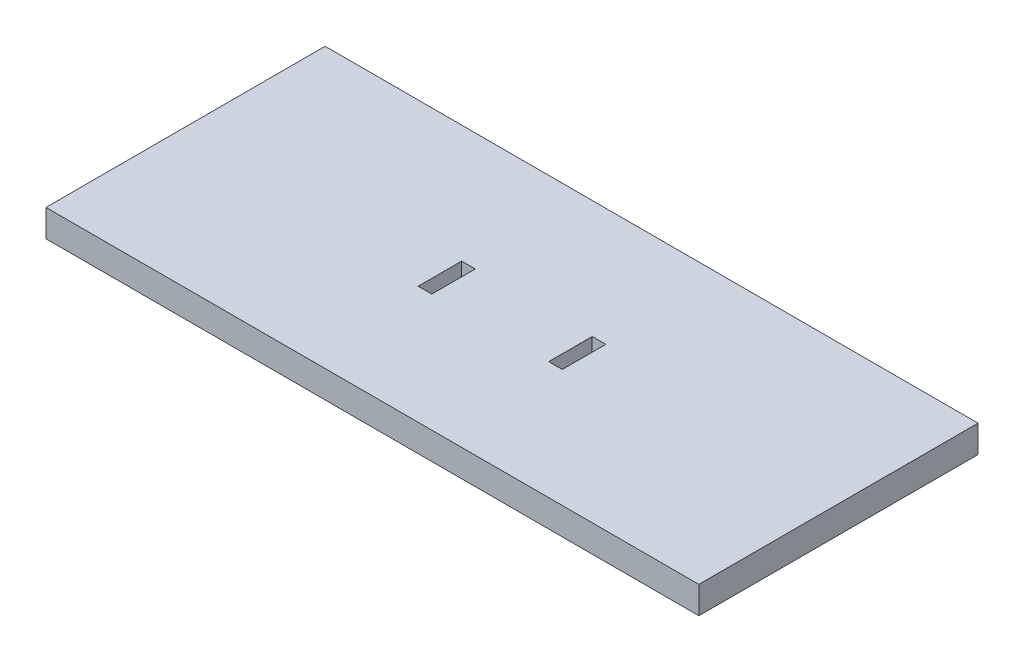
ISO-10303-21;
HEADER;
FILE_DESCRIPTION(('STEP AP214'),'2;1');
FILE_NAME('part.step','',(''),(''),'','','');
FILE_SCHEMA(('AUTOMOTIVE_DESIGN { 1 0 10303 214 1 1 1 1 }'));
ENDSEC;
DATA;
#1=APPLICATION_CONTEXT('core data for automotive mechanical design processes');
#2=APPLICATION_PROTOCOL_DEFINITION('international standard','automotive_design',2000,#1);
#3=PRODUCT_CONTEXT('',#1,'mechanical');
#4=PRODUCT('Part','Part','',(#3));
#5=PRODUCT_RELATED_PRODUCT_CATEGORY('part','',(#4));
#6=PRODUCT_DEFINITION_FORMATION('','',#4);
#7=PRODUCT_DEFINITION_CONTEXT('part definition',#1,'design');
#8=PRODUCT_DEFINITION('design','',#6,#7);
#9=PRODUCT_DEFINITION_SHAPE('','',#8);
#10=(LENGTH_UNIT() NAMED_UNIT(*) SI_UNIT(.MILLI.,.METRE.));
#11=(NAMED_UNIT(*) PLANE_ANGLE_UNIT() SI_UNIT($,.RADIAN.));
#12=(NAMED_UNIT(*) SI_UNIT($,.STERADIAN.) SOLID_ANGLE_UNIT());
#13=UNCERTAINTY_MEASURE_WITH_UNIT(LENGTH_MEASURE(1.E-05),#10,'distance_accuracy_value','');
#14=(GEOMETRIC_REPRESENTATION_CONTEXT(3) GLOBAL_UNCERTAINTY_ASSIGNED_CONTEXT((#13)) GLOBAL_UNIT_ASSIGNED_CONTEXT((#10,
#11,#12)) REPRESENTATION_CONTEXT('',''));
#15=CARTESIAN_POINT('',(0.,0.,0.));
#16=DIRECTION('',(0.,0.,1.));
#17=DIRECTION('',(1.,0.,0.));
#18=AXIS2_PLACEMENT_3D('',#15,#16,#17);
#19=CARTESIAN_POINT('',(0.,5.,0.));
#20=DIRECTION('',(0.,1.,0.));
#21=DIRECTION('',(0.,0.,1.));
#22=AXIS2_PLACEMENT_3D('',#19,#20,#21);
#23=PLANE('',#22);
#24=DIRECTION('',(0.,0.,-1.));
#25=VECTOR('',#24,1.);
#26=CARTESIAN_POINT('',(60.,5.,-25.6535));
#27=LINE('',#26,#25);
#28=CARTESIAN_POINT('',(60.,5.,25.6535));
#29=VERTEX_POINT('',#28);
#30=CARTESIAN_POINT('',(60.,5.,-25.6535));
#31=VERTEX_POINT('',#30);
#32=EDGE_CURVE('E220',#29,#31,#27,.T.);
#33=ORIENTED_EDGE('',*,*,#32,.T.);
#34=DIRECTION('',(-1.,0.,0.));
#35=VECTOR('',#34,1.);
#36=CARTESIAN_POINT('',(-60.,5.,-25.6535));
#37=LINE('',#36,#35);
#38=CARTESIAN_POINT('',(-60.,5.,-25.6535));
#39=VERTEX_POINT('',#38);
#40=EDGE_CURVE('E224',#31,#39,#37,.T.);
#41=ORIENTED_EDGE('',*,*,#40,.T.);
#42=DIRECTION('',(0.,0.,1.));
#43=VECTOR('',#42,1.);
#44=CARTESIAN_POINT('',(-60.,5.,-25.6535));
#45=LINE('',#44,#43);
#46=CARTESIAN_POINT('',(-60.,5.,25.6535));
#47=VERTEX_POINT('',#46);
#48=EDGE_CURVE('E228',#39,#47,#45,.T.);
#49=ORIENTED_EDGE('',*,*,#48,.T.);
#50=DIRECTION('',(1.,0.,0.));
#51=VECTOR('',#50,1.);
#52=CARTESIAN_POINT('',(-60.,5.,25.6535));
#53=LINE('',#52,#51);
#54=EDGE_CURVE('E231',#47,#29,#53,.T.);
#55=ORIENTED_EDGE('',*,*,#54,.T.);
#56=EDGE_LOOP('',(#33,#41,#49,#55));
#57=FACE_BOUND('',#56,.T.);
#58=DIRECTION('',(-1.,0.,0.));
#59=VECTOR('',#58,1.);
#60=CARTESIAN_POINT('',(-13.25,5.,-3.99999999999999));
#61=LINE('',#60,#59);
#62=CARTESIAN_POINT('',(-10.75,5.,-3.99999999999999));
#63=VERTEX_POINT('',#62);
#64=CARTESIAN_POINT('',(-13.25,5.,-3.99999999999999));
#65=VERTEX_POINT('',#64);
#66=EDGE_CURVE('E180',#63,#65,#61,.T.);
#67=ORIENTED_EDGE('',*,*,#66,.F.);
#68=DIRECTION('',(0.,0.,-1.));
#69=VECTOR('',#68,1.);
#70=CARTESIAN_POINT('',(-10.75,5.,-3.99999999999999));
#71=LINE('',#70,#69);
#72=CARTESIAN_POINT('',(-10.75,5.,4.00000000000001));
#73=VERTEX_POINT('',#72);
#74=EDGE_CURVE('E177',#73,#63,#71,.T.);
#75=ORIENTED_EDGE('',*,*,#74,.F.);
#76=DIRECTION('',(1.,0.,0.));
#77=VECTOR('',#76,1.);
#78=CARTESIAN_POINT('',(-13.25,5.,4.00000000000001));
#79=LINE('',#78,#77);
#80=CARTESIAN_POINT('',(-13.25,5.,4.00000000000001));
#81=VERTEX_POINT('',#80);
#82=EDGE_CURVE('E188',#81,#73,#79,.T.);
#83=ORIENTED_EDGE('',*,*,#82,.F.);
#84=DIRECTION('',(0.,0.,1.));
#85=VECTOR('',#84,1.);
#86=CARTESIAN_POINT('',(-13.25,5.,-3.99999999999999));
#87=LINE('',#86,#85);
#88=EDGE_CURVE('E184',#65,#81,#87,.T.);
#89=ORIENTED_EDGE('',*,*,#88,.F.);
#90=EDGE_LOOP('',(#67,#75,#83,#89));
#91=FACE_BOUND('',#90,.T.);
#92=DIRECTION('',(-1.,0.,0.));
#93=VECTOR('',#92,1.);
#94=CARTESIAN_POINT('',(13.25,5.,-3.99999999999999));
#95=LINE('',#94,#93);
#96=CARTESIAN_POINT('',(13.25,5.,-3.99999999999999));
#97=VERTEX_POINT('',#96);
#98=CARTESIAN_POINT('',(10.75,5.,-3.99999999999999));
#99=VERTEX_POINT('',#98);
#100=EDGE_CURVE('E138',#97,#99,#95,.T.);
#101=ORIENTED_EDGE('',*,*,#100,.F.);
#102=DIRECTION('',(0.,0.,-1.));
#103=VECTOR('',#102,1.);
#104=CARTESIAN_POINT('',(13.25,5.,-3.99999999999999));
#105=LINE('',#104,#103);
#106=CARTESIAN_POINT('',(13.25,5.,4.00000000000001));
#107=VERTEX_POINT('',#106);
#108=EDGE_CURVE('E129',#107,#97,#105,.T.);
#109=ORIENTED_EDGE('',*,*,#108,.F.);
#110=DIRECTION('',(1.,0.,0.));
#111=VECTOR('',#110,1.);
#112=CARTESIAN_POINT('',(13.25,5.,4.00000000000001));
#113=LINE('',#112,#111);
#114=CARTESIAN_POINT('',(10.75,5.,4.00000000000001));
#115=VERTEX_POINT('',#114);
#116=EDGE_CURVE('E155',#115,#107,#113,.T.);
#117=ORIENTED_EDGE('',*,*,#116,.F.);
#118=DIRECTION('',(0.,0.,1.));
#119=VECTOR('',#118,1.);
#120=CARTESIAN_POINT('',(10.75,5.,-3.99999999999999));
#121=LINE('',#120,#119);
#122=EDGE_CURVE('E151',#99,#115,#121,.T.);
#123=ORIENTED_EDGE('',*,*,#122,.F.);
#124=EDGE_LOOP('',(#101,#109,#117,#123));
#125=FACE_BOUND('',#124,.T.);
#126=ADVANCED_FACE('F39',(#57,#91,#125),#23,.T.);
#127=CARTESIAN_POINT('',(0.,0.,0.));
#128=DIRECTION('',(0.,1.,0.));
#129=DIRECTION('',(0.,0.,1.));
#130=AXIS2_PLACEMENT_3D('',#127,#128,#129);
#131=PLANE('',#130);
#132=DIRECTION('',(0.,0.,-1.));
#133=VECTOR('',#132,1.);
#134=CARTESIAN_POINT('',(-10.75,0.,-3.99999999999999));
#135=LINE('',#134,#133);
#136=CARTESIAN_POINT('',(-10.75,0.,4.00000000000001));
#137=VERTEX_POINT('',#136);
#138=CARTESIAN_POINT('',(-10.75,0.,-3.99999999999999));
#139=VERTEX_POINT('',#138);
#140=EDGE_CURVE('E147',#137,#139,#135,.T.);
#141=ORIENTED_EDGE('',*,*,#140,.T.);
#142=DIRECTION('',(-1.,0.,0.));
#143=VECTOR('',#142,1.);
#144=CARTESIAN_POINT('',(-13.25,0.,-3.99999999999999));
#145=LINE('',#144,#143);
#146=CARTESIAN_POINT('',(-13.25,0.,-3.99999999999999));
#147=VERTEX_POINT('',#146);
#148=EDGE_CURVE('E195',#139,#147,#145,.T.);
#149=ORIENTED_EDGE('',*,*,#148,.T.);
#150=DIRECTION('',(0.,0.,1.));
#151=VECTOR('',#150,1.);
#152=CARTESIAN_POINT('',(-13.25,0.,-3.99999999999999));
#153=LINE('',#152,#151);
#154=CARTESIAN_POINT('',(-13.25,0.,4.00000000000001));
#155=VERTEX_POINT('',#154);
#156=EDGE_CURVE('E199',#147,#155,#153,.T.);
#157=ORIENTED_EDGE('',*,*,#156,.T.);
#158=DIRECTION('',(1.,0.,0.));
#159=VECTOR('',#158,1.);
#160=CARTESIAN_POINT('',(-13.25,0.,4.00000000000001));
#161=LINE('',#160,#159);
#162=EDGE_CURVE('E181',#155,#137,#161,.T.);
#163=ORIENTED_EDGE('',*,*,#162,.T.);
#164=EDGE_LOOP('',(#141,#149,#157,#163));
#165=FACE_BOUND('',#164,.T.);
#166=DIRECTION('',(0.,0.,-1.));
#167=VECTOR('',#166,1.);
#168=CARTESIAN_POINT('',(60.,0.,-25.6535));
#169=LINE('',#168,#167);
#170=CARTESIAN_POINT('',(60.,0.,25.6535));
#171=VERTEX_POINT('',#170);
#172=CARTESIAN_POINT('',(60.,0.,-25.6535));
#173=VERTEX_POINT('',#172);
#174=EDGE_CURVE('E219',#171,#173,#169,.T.);
#175=ORIENTED_EDGE('',*,*,#174,.F.);
#176=DIRECTION('',(1.,0.,0.));
#177=VECTOR('',#176,1.);
#178=CARTESIAN_POINT('',(-60.,0.,25.6535));
#179=LINE('',#178,#177);
#180=CARTESIAN_POINT('',(-60.,0.,25.6535));
#181=VERTEX_POINT('',#180);
#182=EDGE_CURVE('E225',#181,#171,#179,.T.);
#183=ORIENTED_EDGE('',*,*,#182,.F.);
#184=DIRECTION('',(0.,0.,1.));
#185=VECTOR('',#184,1.);
#186=CARTESIAN_POINT('',(-60.,0.,-25.6535));
#187=LINE('',#186,#185);
#188=CARTESIAN_POINT('',(-60.,0.,-25.6535));
#189=VERTEX_POINT('',#188);
#190=EDGE_CURVE('E241',#189,#181,#187,.T.);
#191=ORIENTED_EDGE('',*,*,#190,.F.);
#192=DIRECTION('',(-1.,0.,0.));
#193=VECTOR('',#192,1.);
#194=CARTESIAN_POINT('',(-60.,0.,-25.6535));
#195=LINE('',#194,#193);
#196=EDGE_CURVE('E238',#173,#189,#195,.T.);
#197=ORIENTED_EDGE('',*,*,#196,.F.);
#198=EDGE_LOOP('',(#175,#183,#191,#197));
#199=FACE_BOUND('',#198,.T.);
#200=DIRECTION('',(0.,0.,-1.));
#201=VECTOR('',#200,1.);
#202=CARTESIAN_POINT('',(13.25,0.,-3.99999999999999));
#203=LINE('',#202,#201);
#204=CARTESIAN_POINT('',(13.25,0.,4.00000000000001));
#205=VERTEX_POINT('',#204);
#206=CARTESIAN_POINT('',(13.25,0.,-3.99999999999999));
#207=VERTEX_POINT('',#206);
#208=EDGE_CURVE('E63',#205,#207,#203,.T.);
#209=ORIENTED_EDGE('',*,*,#208,.T.);
#210=DIRECTION('',(-1.,0.,0.));
#211=VECTOR('',#210,1.);
#212=CARTESIAN_POINT('',(13.25,0.,-3.99999999999999));
#213=LINE('',#212,#211);
#214=CARTESIAN_POINT('',(10.75,0.,-3.99999999999999));
#215=VERTEX_POINT('',#214);
#216=EDGE_CURVE('E145',#207,#215,#213,.T.);
#217=ORIENTED_EDGE('',*,*,#216,.T.);
#218=DIRECTION('',(0.,0.,1.));
#219=VECTOR('',#218,1.);
#220=CARTESIAN_POINT('',(10.75,0.,-3.99999999999999));
#221=LINE('',#220,#219);
#222=CARTESIAN_POINT('',(10.75,0.,4.00000000000001));
#223=VERTEX_POINT('',#222);
#224=EDGE_CURVE('E164',#215,#223,#221,.T.);
#225=ORIENTED_EDGE('',*,*,#224,.T.);
#226=DIRECTION('',(1.,0.,0.));
#227=VECTOR('',#226,1.);
#228=CARTESIAN_POINT('',(13.25,0.,4.00000000000001));
#229=LINE('',#228,#227);
#230=EDGE_CURVE('E139',#223,#205,#229,.T.);
#231=ORIENTED_EDGE('',*,*,#230,.T.);
#232=EDGE_LOOP('',(#209,#217,#225,#231));
#233=FACE_BOUND('',#232,.T.);
#234=ADVANCED_FACE('F264',(#165,#199,#233),#131,.F.);
#235=CARTESIAN_POINT('',(60.,5.,-25.6535));
#236=DIRECTION('',(-1.,0.,0.));
#237=DIRECTION('',(0.,0.,1.));
#238=AXIS2_PLACEMENT_3D('',#235,#236,#237);
#239=PLANE('',#238);
#240=ORIENTED_EDGE('',*,*,#174,.T.);
#241=DIRECTION('',(0.,-1.,0.));
#242=VECTOR('',#241,1.);
#243=CARTESIAN_POINT('',(60.,5.,-25.6535));
#244=LINE('',#243,#242);
#245=EDGE_CURVE('E11',#31,#173,#244,.T.);
#246=ORIENTED_EDGE('',*,*,#245,.F.);
#247=ORIENTED_EDGE('',*,*,#32,.F.);
#248=DIRECTION('',(0.,-1.,0.));
#249=VECTOR('',#248,1.);
#250=CARTESIAN_POINT('',(60.,5.,25.6535));
#251=LINE('',#250,#249);
#252=EDGE_CURVE('E234',#29,#171,#251,.T.);
#253=ORIENTED_EDGE('',*,*,#252,.T.);
#254=EDGE_LOOP('',(#240,#246,#247,#253));
#255=FACE_BOUND('',#254,.T.);
#256=ADVANCED_FACE('F41',(#255),#239,.F.);
#257=CARTESIAN_POINT('',(-60.,5.,-25.6535));
#258=DIRECTION('',(0.,0.,1.));
#259=DIRECTION('',(1.,0.,0.));
#260=AXIS2_PLACEMENT_3D('',#257,#258,#259);
#261=PLANE('',#260);
#262=ORIENTED_EDGE('',*,*,#196,.T.);
#263=DIRECTION('',(0.,-1.,0.));
#264=VECTOR('',#263,1.);
#265=CARTESIAN_POINT('',(-60.,5.,-25.6535));
#266=LINE('',#265,#264);
#267=EDGE_CURVE('E48',#39,#189,#266,.T.);
#268=ORIENTED_EDGE('',*,*,#267,.F.);
#269=ORIENTED_EDGE('',*,*,#40,.F.);
#270=ORIENTED_EDGE('',*,*,#245,.T.);
#271=EDGE_LOOP('',(#262,#268,#269,#270));
#272=FACE_BOUND('',#271,.T.);
#273=ADVANCED_FACE('F275',(#272),#261,.F.);
#274=CARTESIAN_POINT('',(-60.,5.,-25.6535));
#275=DIRECTION('',(1.,0.,0.));
#276=DIRECTION('',(0.,0.,-1.));
#277=AXIS2_PLACEMENT_3D('',#274,#275,#276);
#278=PLANE('',#277);
#279=ORIENTED_EDGE('',*,*,#190,.T.);
#280=DIRECTION('',(0.,-1.,0.));
#281=VECTOR('',#280,1.);
#282=CARTESIAN_POINT('',(-60.,5.,25.6535));
#283=LINE('',#282,#281);
#284=EDGE_CURVE('E249',#47,#181,#283,.T.);
#285=ORIENTED_EDGE('',*,*,#284,.F.);
#286=ORIENTED_EDGE('',*,*,#48,.F.);
#287=ORIENTED_EDGE('',*,*,#267,.T.);
#288=EDGE_LOOP('',(#279,#285,#286,#287));
#289=FACE_BOUND('',#288,.T.);
#290=ADVANCED_FACE('F258',(#289),#278,.F.);
#291=CARTESIAN_POINT('',(-60.,5.,25.6535));
#292=DIRECTION('',(0.,0.,-1.));
#293=DIRECTION('',(-1.,0.,0.));
#294=AXIS2_PLACEMENT_3D('',#291,#292,#293);
#295=PLANE('',#294);
#296=ORIENTED_EDGE('',*,*,#182,.T.);
#297=ORIENTED_EDGE('',*,*,#252,.F.);
#298=ORIENTED_EDGE('',*,*,#54,.F.);
#299=ORIENTED_EDGE('',*,*,#284,.T.);
#300=EDGE_LOOP('',(#296,#297,#298,#299));
#301=FACE_BOUND('',#300,.T.);
#302=ADVANCED_FACE('F268',(#301),#295,.F.);
#303=CARTESIAN_POINT('',(-10.75,5.,-3.99999999999999));
#304=DIRECTION('',(-1.,0.,0.));
#305=DIRECTION('',(0.,0.,1.));
#306=AXIS2_PLACEMENT_3D('',#303,#304,#305);
#307=PLANE('',#306);
#308=ORIENTED_EDGE('',*,*,#140,.F.);
#309=DIRECTION('',(0.,-1.,0.));
#310=VECTOR('',#309,1.);
#311=CARTESIAN_POINT('',(-10.75,5.,4.00000000000001));
#312=LINE('',#311,#310);
#313=EDGE_CURVE('E191',#73,#137,#312,.T.);
#314=ORIENTED_EDGE('',*,*,#313,.F.);
#315=ORIENTED_EDGE('',*,*,#74,.T.);
#316=DIRECTION('',(0.,-1.,0.));
#317=VECTOR('',#316,1.);
#318=CARTESIAN_POINT('',(-10.75,5.,-3.99999999999999));
#319=LINE('',#318,#317);
#320=EDGE_CURVE('E215',#63,#139,#319,.T.);
#321=ORIENTED_EDGE('',*,*,#320,.T.);
#322=EDGE_LOOP('',(#308,#314,#315,#321));
#323=FACE_BOUND('',#322,.T.);
#324=ADVANCED_FACE('F290',(#323),#307,.T.);
#325=CARTESIAN_POINT('',(-13.25,5.,-3.99999999999999));
#326=DIRECTION('',(0.,0.,1.));
#327=DIRECTION('',(1.,0.,0.));
#328=AXIS2_PLACEMENT_3D('',#325,#326,#327);
#329=PLANE('',#328);
#330=ORIENTED_EDGE('',*,*,#148,.F.);
#331=ORIENTED_EDGE('',*,*,#320,.F.);
#332=ORIENTED_EDGE('',*,*,#66,.T.);
#333=DIRECTION('',(0.,-1.,0.));
#334=VECTOR('',#333,1.);
#335=CARTESIAN_POINT('',(-13.25,5.,-3.99999999999999));
#336=LINE('',#335,#334);
#337=EDGE_CURVE('E212',#65,#147,#336,.T.);
#338=ORIENTED_EDGE('',*,*,#337,.T.);
#339=EDGE_LOOP('',(#330,#331,#332,#338));
#340=FACE_BOUND('',#339,.T.);
#341=ADVANCED_FACE('F297',(#340),#329,.T.);
#342=CARTESIAN_POINT('',(-13.25,5.,-3.99999999999999));
#343=DIRECTION('',(1.,0.,0.));
#344=DIRECTION('',(0.,0.,-1.));
#345=AXIS2_PLACEMENT_3D('',#342,#343,#344);
#346=PLANE('',#345);
#347=ORIENTED_EDGE('',*,*,#156,.F.);
#348=ORIENTED_EDGE('',*,*,#337,.F.);
#349=ORIENTED_EDGE('',*,*,#88,.T.);
#350=DIRECTION('',(0.,-1.,0.));
#351=VECTOR('',#350,1.);
#352=CARTESIAN_POINT('',(-13.25,5.,4.00000000000001));
#353=LINE('',#352,#351);
#354=EDGE_CURVE('E209',#81,#155,#353,.T.);
#355=ORIENTED_EDGE('',*,*,#354,.T.);
#356=EDGE_LOOP('',(#347,#348,#349,#355));
#357=FACE_BOUND('',#356,.T.);
#358=ADVANCED_FACE('F302',(#357),#346,.T.);
#359=CARTESIAN_POINT('',(-13.25,5.,4.00000000000001));
#360=DIRECTION('',(0.,0.,-1.));
#361=DIRECTION('',(-1.,0.,0.));
#362=AXIS2_PLACEMENT_3D('',#359,#360,#361);
#363=PLANE('',#362);
#364=ORIENTED_EDGE('',*,*,#162,.F.);
#365=ORIENTED_EDGE('',*,*,#354,.F.);
#366=ORIENTED_EDGE('',*,*,#82,.T.);
#367=ORIENTED_EDGE('',*,*,#313,.T.);
#368=EDGE_LOOP('',(#364,#365,#366,#367));
#369=FACE_BOUND('',#368,.T.);
#370=ADVANCED_FACE('F309',(#369),#363,.T.);
#371=CARTESIAN_POINT('',(13.25,5.,-3.99999999999999));
#372=DIRECTION('',(-1.,0.,0.));
#373=DIRECTION('',(0.,0.,1.));
#374=AXIS2_PLACEMENT_3D('',#371,#372,#373);
#375=PLANE('',#374);
#376=ORIENTED_EDGE('',*,*,#208,.F.);
#377=DIRECTION('',(0.,-1.,0.));
#378=VECTOR('',#377,1.);
#379=CARTESIAN_POINT('',(13.25,5.,4.00000000000001));
#380=LINE('',#379,#378);
#381=EDGE_CURVE('E133',#107,#205,#380,.T.);
#382=ORIENTED_EDGE('',*,*,#381,.F.);
#383=ORIENTED_EDGE('',*,*,#108,.T.);
#384=DIRECTION('',(0.,-1.,0.));
#385=VECTOR('',#384,1.);
#386=CARTESIAN_POINT('',(13.25,5.,-3.99999999999999));
#387=LINE('',#386,#385);
#388=EDGE_CURVE('E132',#97,#207,#387,.T.);
#389=ORIENTED_EDGE('',*,*,#388,.T.);
#390=EDGE_LOOP('',(#376,#382,#383,#389));
#391=FACE_BOUND('',#390,.T.);
#392=ADVANCED_FACE('F131',(#391),#375,.T.);
#393=CARTESIAN_POINT('',(13.25,5.,-3.99999999999999));
#394=DIRECTION('',(0.,0.,1.));
#395=DIRECTION('',(1.,0.,0.));
#396=AXIS2_PLACEMENT_3D('',#393,#394,#395);
#397=PLANE('',#396);
#398=ORIENTED_EDGE('',*,*,#216,.F.);
#399=ORIENTED_EDGE('',*,*,#388,.F.);
#400=ORIENTED_EDGE('',*,*,#100,.T.);
#401=DIRECTION('',(0.,-1.,0.));
#402=VECTOR('',#401,1.);
#403=CARTESIAN_POINT('',(10.75,5.,-3.99999999999999));
#404=LINE('',#403,#402);
#405=EDGE_CURVE('E148',#99,#215,#404,.T.);
#406=ORIENTED_EDGE('',*,*,#405,.T.);
#407=EDGE_LOOP('',(#398,#399,#400,#406));
#408=FACE_BOUND('',#407,.T.);
#409=ADVANCED_FACE('F142',(#408),#397,.T.);
#410=CARTESIAN_POINT('',(10.75,5.,-3.99999999999999));
#411=DIRECTION('',(1.,0.,0.));
#412=DIRECTION('',(0.,0.,-1.));
#413=AXIS2_PLACEMENT_3D('',#410,#411,#412);
#414=PLANE('',#413);
#415=ORIENTED_EDGE('',*,*,#224,.F.);
#416=ORIENTED_EDGE('',*,*,#405,.F.);
#417=ORIENTED_EDGE('',*,*,#122,.T.);
#418=DIRECTION('',(0.,-1.,0.));
#419=VECTOR('',#418,1.);
#420=CARTESIAN_POINT('',(10.75,5.,4.00000000000001));
#421=LINE('',#420,#419);
#422=EDGE_CURVE('E55',#115,#223,#421,.T.);
#423=ORIENTED_EDGE('',*,*,#422,.T.);
#424=EDGE_LOOP('',(#415,#416,#417,#423));
#425=FACE_BOUND('',#424,.T.);
#426=ADVANCED_FACE('F327',(#425),#414,.T.);
#427=CARTESIAN_POINT('',(13.25,5.,4.00000000000001));
#428=DIRECTION('',(0.,0.,-1.));
#429=DIRECTION('',(-1.,0.,0.));
#430=AXIS2_PLACEMENT_3D('',#427,#428,#429);
#431=PLANE('',#430);
#432=ORIENTED_EDGE('',*,*,#230,.F.);
#433=ORIENTED_EDGE('',*,*,#422,.F.);
#434=ORIENTED_EDGE('',*,*,#116,.T.);
#435=ORIENTED_EDGE('',*,*,#381,.T.);
#436=EDGE_LOOP('',(#432,#433,#434,#435));
#437=FACE_BOUND('',#436,.T.);
#438=ADVANCED_FACE('F330',(#437),#431,.T.);
#439=CLOSED_SHELL('',(#126,#234,#256,#273,#290,#302,#324,#341,#358,#370,#392,#409,#426,#438));
#440=MANIFOLD_SOLID_BREP('B2',#439);
#441=ADVANCED_BREP_SHAPE_REPRESENTATION('',(#18,#440),#14);
#442=SHAPE_DEFINITION_REPRESENTATION(#9,#441);
ENDSEC;
END-ISO-10303-21;
